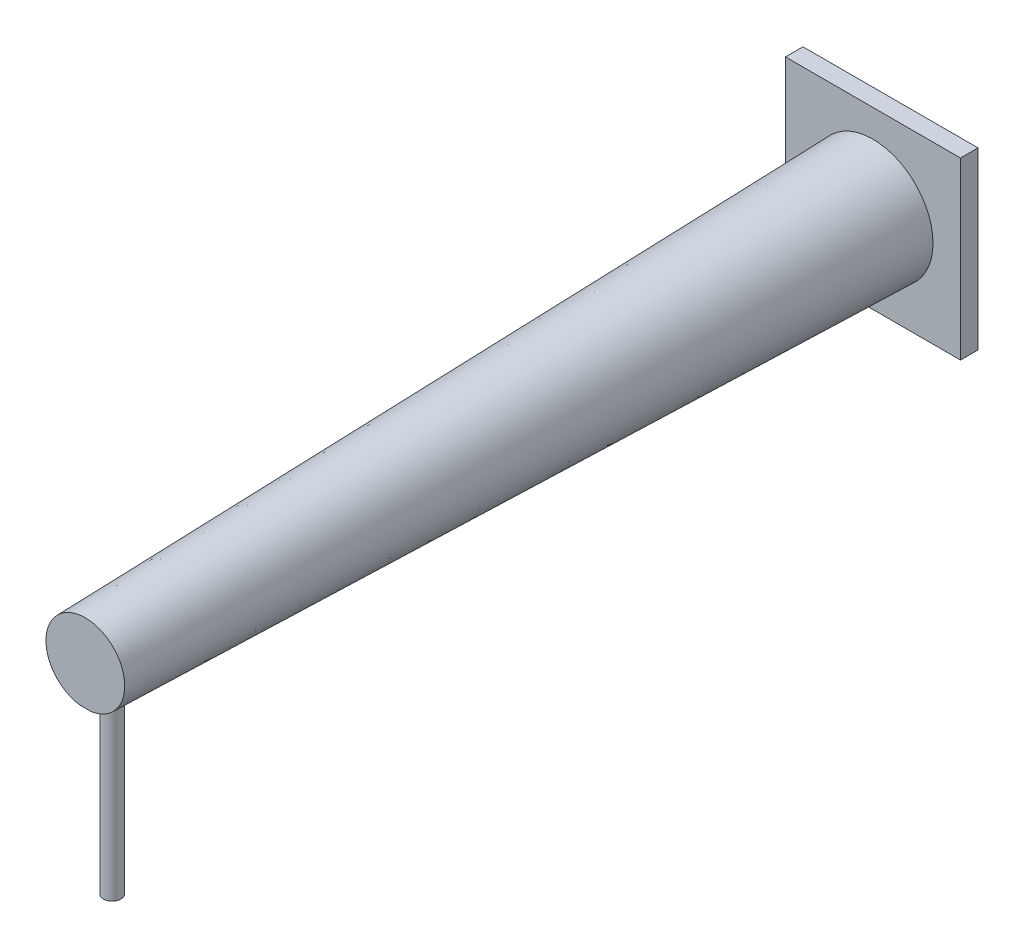
ISO-10303-21;
HEADER;
FILE_DESCRIPTION(('STEP AP214'),'2;1');
FILE_NAME('part.step','',(''),(''),'','','');
FILE_SCHEMA(('AUTOMOTIVE_DESIGN { 1 0 10303 214 1 1 1 1 }'));
ENDSEC;
DATA;
#1=APPLICATION_CONTEXT('core data for automotive mechanical design processes');
#2=APPLICATION_PROTOCOL_DEFINITION('international standard','automotive_design',2000,#1);
#3=PRODUCT_CONTEXT('',#1,'mechanical');
#4=PRODUCT('Part','Part','',(#3));
#5=PRODUCT_RELATED_PRODUCT_CATEGORY('part','',(#4));
#6=PRODUCT_DEFINITION_FORMATION('','',#4);
#7=PRODUCT_DEFINITION_CONTEXT('part definition',#1,'design');
#8=PRODUCT_DEFINITION('design','',#6,#7);
#9=PRODUCT_DEFINITION_SHAPE('','',#8);
#10=(LENGTH_UNIT() NAMED_UNIT(*) SI_UNIT(.MILLI.,.METRE.));
#11=(NAMED_UNIT(*) PLANE_ANGLE_UNIT() SI_UNIT($,.RADIAN.));
#12=(NAMED_UNIT(*) SI_UNIT($,.STERADIAN.) SOLID_ANGLE_UNIT());
#13=UNCERTAINTY_MEASURE_WITH_UNIT(LENGTH_MEASURE(1.E-05),#10,'distance_accuracy_value','');
#14=(GEOMETRIC_REPRESENTATION_CONTEXT(3) GLOBAL_UNCERTAINTY_ASSIGNED_CONTEXT((#13)) GLOBAL_UNIT_ASSIGNED_CONTEXT((#10,
#11,#12)) REPRESENTATION_CONTEXT('',''));
#15=CARTESIAN_POINT('',(0.,0.,0.));
#16=DIRECTION('',(0.,0.,1.));
#17=DIRECTION('',(1.,0.,0.));
#18=AXIS2_PLACEMENT_3D('',#15,#16,#17);
#19=CARTESIAN_POINT('',(50.,50.,10.));
#20=DIRECTION('',(0.,-1.,0.));
#21=DIRECTION('',(0.,0.,-1.));
#22=AXIS2_PLACEMENT_3D('',#19,#20,#21);
#23=PLANE('',#22);
#24=DIRECTION('',(-1.,0.,0.));
#25=VECTOR('',#24,1.);
#26=CARTESIAN_POINT('',(50.,50.,0.));
#27=LINE('',#26,#25);
#28=CARTESIAN_POINT('',(50.,50.,0.));
#29=VERTEX_POINT('',#28);
#30=CARTESIAN_POINT('',(-50.,50.,0.));
#31=VERTEX_POINT('',#30);
#32=EDGE_CURVE('E144',#29,#31,#27,.T.);
#33=ORIENTED_EDGE('',*,*,#32,.T.);
#34=DIRECTION('',(0.,0.,-1.));
#35=VECTOR('',#34,1.);
#36=CARTESIAN_POINT('',(-50.,50.,10.));
#37=LINE('',#36,#35);
#38=CARTESIAN_POINT('',(-50.,50.,10.));
#39=VERTEX_POINT('',#38);
#40=EDGE_CURVE('E146',#39,#31,#37,.T.);
#41=ORIENTED_EDGE('',*,*,#40,.F.);
#42=DIRECTION('',(-1.,0.,0.));
#43=VECTOR('',#42,1.);
#44=CARTESIAN_POINT('',(50.,50.,10.));
#45=LINE('',#44,#43);
#46=CARTESIAN_POINT('',(50.,50.,10.));
#47=VERTEX_POINT('',#46);
#48=EDGE_CURVE('E173',#47,#39,#45,.T.);
#49=ORIENTED_EDGE('',*,*,#48,.F.);
#50=DIRECTION('',(0.,0.,-1.));
#51=VECTOR('',#50,1.);
#52=CARTESIAN_POINT('',(50.,50.,10.));
#53=LINE('',#52,#51);
#54=EDGE_CURVE('E147',#47,#29,#53,.T.);
#55=ORIENTED_EDGE('',*,*,#54,.T.);
#56=EDGE_LOOP('',(#33,#41,#49,#55));
#57=FACE_BOUND('',#56,.T.);
#58=ADVANCED_FACE('F16',(#57),#23,.F.);
#59=CARTESIAN_POINT('',(-50.,50.,10.));
#60=DIRECTION('',(1.,0.,0.));
#61=DIRECTION('',(0.,0.,-1.));
#62=AXIS2_PLACEMENT_3D('',#59,#60,#61);
#63=PLANE('',#62);
#64=DIRECTION('',(0.,-1.,0.));
#65=VECTOR('',#64,1.);
#66=CARTESIAN_POINT('',(-50.,50.,0.));
#67=LINE('',#66,#65);
#68=CARTESIAN_POINT('',(-50.,-50.,0.));
#69=VERTEX_POINT('',#68);
#70=EDGE_CURVE('E149',#31,#69,#67,.T.);
#71=ORIENTED_EDGE('',*,*,#70,.T.);
#72=DIRECTION('',(0.,0.,-1.));
#73=VECTOR('',#72,1.);
#74=CARTESIAN_POINT('',(-50.,-50.,10.));
#75=LINE('',#74,#73);
#76=CARTESIAN_POINT('',(-50.,-50.,10.));
#77=VERTEX_POINT('',#76);
#78=EDGE_CURVE('E163',#77,#69,#75,.T.);
#79=ORIENTED_EDGE('',*,*,#78,.F.);
#80=DIRECTION('',(0.,-1.,0.));
#81=VECTOR('',#80,1.);
#82=CARTESIAN_POINT('',(-50.,50.,10.));
#83=LINE('',#82,#81);
#84=EDGE_CURVE('E70',#39,#77,#83,.T.);
#85=ORIENTED_EDGE('',*,*,#84,.F.);
#86=ORIENTED_EDGE('',*,*,#40,.T.);
#87=EDGE_LOOP('',(#71,#79,#85,#86));
#88=FACE_BOUND('',#87,.T.);
#89=ADVANCED_FACE('F133',(#88),#63,.F.);
#90=CARTESIAN_POINT('',(-50.,-50.,10.));
#91=DIRECTION('',(0.,1.,0.));
#92=DIRECTION('',(0.,0.,1.));
#93=AXIS2_PLACEMENT_3D('',#90,#91,#92);
#94=PLANE('',#93);
#95=DIRECTION('',(1.,0.,0.));
#96=VECTOR('',#95,1.);
#97=CARTESIAN_POINT('',(-50.,-50.,0.));
#98=LINE('',#97,#96);
#99=CARTESIAN_POINT('',(50.,-50.,0.));
#100=VERTEX_POINT('',#99);
#101=EDGE_CURVE('E154',#69,#100,#98,.T.);
#102=ORIENTED_EDGE('',*,*,#101,.T.);
#103=DIRECTION('',(0.,0.,-1.));
#104=VECTOR('',#103,1.);
#105=CARTESIAN_POINT('',(50.,-50.,10.));
#106=LINE('',#105,#104);
#107=CARTESIAN_POINT('',(50.,-50.,10.));
#108=VERTEX_POINT('',#107);
#109=EDGE_CURVE('E161',#108,#100,#106,.T.);
#110=ORIENTED_EDGE('',*,*,#109,.F.);
#111=DIRECTION('',(1.,0.,0.));
#112=VECTOR('',#111,1.);
#113=CARTESIAN_POINT('',(-50.,-50.,10.));
#114=LINE('',#113,#112);
#115=EDGE_CURVE('E169',#77,#108,#114,.T.);
#116=ORIENTED_EDGE('',*,*,#115,.F.);
#117=ORIENTED_EDGE('',*,*,#78,.T.);
#118=EDGE_LOOP('',(#102,#110,#116,#117));
#119=FACE_BOUND('',#118,.T.);
#120=ADVANCED_FACE('F130',(#119),#94,.F.);
#121=CARTESIAN_POINT('',(50.,-50.,10.));
#122=DIRECTION('',(-1.,0.,0.));
#123=DIRECTION('',(0.,0.,1.));
#124=AXIS2_PLACEMENT_3D('',#121,#122,#123);
#125=PLANE('',#124);
#126=DIRECTION('',(0.,1.,0.));
#127=VECTOR('',#126,1.);
#128=CARTESIAN_POINT('',(50.,-50.,0.));
#129=LINE('',#128,#127);
#130=EDGE_CURVE('E62',#100,#29,#129,.T.);
#131=ORIENTED_EDGE('',*,*,#130,.T.);
#132=ORIENTED_EDGE('',*,*,#54,.F.);
#133=DIRECTION('',(0.,1.,0.));
#134=VECTOR('',#133,1.);
#135=CARTESIAN_POINT('',(50.,-50.,10.));
#136=LINE('',#135,#134);
#137=EDGE_CURVE('E41',#108,#47,#136,.T.);
#138=ORIENTED_EDGE('',*,*,#137,.F.);
#139=ORIENTED_EDGE('',*,*,#109,.T.);
#140=EDGE_LOOP('',(#131,#132,#138,#139));
#141=FACE_BOUND('',#140,.T.);
#142=ADVANCED_FACE('F123',(#141),#125,.F.);
#143=CARTESIAN_POINT('',(0.,0.,10.));
#144=DIRECTION('',(0.,0.,1.));
#145=DIRECTION('',(1.,0.,0.));
#146=AXIS2_PLACEMENT_3D('',#143,#144,#145);
#147=PLANE('',#146);
#148=CARTESIAN_POINT('',(0.,0.,10.));
#149=DIRECTION('',(0.,0.,1.));
#150=DIRECTION('',(1.,0.,0.));
#151=AXIS2_PLACEMENT_3D('',#148,#149,#150);
#152=CIRCLE('',#151,34.2836647061341);
#153=CARTESIAN_POINT('',(34.2836647061341,0.,10.));
#154=VERTEX_POINT('',#153);
#155=EDGE_CURVE('E93',#154,#154,#152,.F.);
#156=ORIENTED_EDGE('',*,*,#155,.T.);
#157=EDGE_LOOP('',(#156));
#158=FACE_BOUND('',#157,.T.);
#159=ORIENTED_EDGE('',*,*,#48,.T.);
#160=ORIENTED_EDGE('',*,*,#84,.T.);
#161=ORIENTED_EDGE('',*,*,#115,.T.);
#162=ORIENTED_EDGE('',*,*,#137,.T.);
#163=EDGE_LOOP('',(#159,#160,#161,#162));
#164=FACE_BOUND('',#163,.T.);
#165=ADVANCED_FACE('F119',(#158,#164),#147,.T.);
#166=CARTESIAN_POINT('',(0.,0.,0.));
#167=DIRECTION('',(0.,0.,1.));
#168=DIRECTION('',(1.,0.,0.));
#169=AXIS2_PLACEMENT_3D('',#166,#167,#168);
#170=PLANE('',#169);
#171=ORIENTED_EDGE('',*,*,#32,.F.);
#172=ORIENTED_EDGE('',*,*,#130,.F.);
#173=ORIENTED_EDGE('',*,*,#101,.F.);
#174=ORIENTED_EDGE('',*,*,#70,.F.);
#175=EDGE_LOOP('',(#171,#172,#173,#174));
#176=FACE_BOUND('',#175,.T.);
#177=ADVANCED_FACE('F122',(#176),#170,.F.);
#178=CARTESIAN_POINT('',(0.,0.,460.));
#179=DIRECTION('',(0.,0.,-1.));
#180=DIRECTION('',(1.,0.,0.));
#181=AXIS2_PLACEMENT_3D('',#178,#179,#180);
#182=CONICAL_SURFACE('',#181,22.5,0.0261799387799149);
#183=CARTESIAN_POINT('',(8.94782583044672,-22.2590713590176,403.09143950879));
#184=CARTESIAN_POINT('',(8.81121618471671,-22.2590713590176,405.03666251518));
#185=CARTESIAN_POINT('',(8.67200421125268,-22.2590713590176,406.981706112306));
#186=CARTESIAN_POINT('',(8.3873810814656,-22.2590713590176,410.871361364087));
#187=CARTESIAN_POINT('',(8.24196985474241,-22.2590713590176,412.815973013584));
#188=CARTESIAN_POINT('',(7.94389281541121,-22.2590713590176,416.70548130393));
#189=CARTESIAN_POINT('',(7.79122391685583,-22.2590713590176,418.650377709056));
#190=CARTESIAN_POINT('',(7.47731813674799,-22.2590713590176,422.539470138632));
#191=CARTESIAN_POINT('',(7.31608130406305,-22.2590713590176,424.483666167013));
#192=CARTESIAN_POINT('',(6.98351976372915,-22.2590713590176,428.36752289011));
#193=CARTESIAN_POINT('',(6.81221455777218,-22.2590713590176,430.307185248331));
#194=CARTESIAN_POINT('',(6.45669313566351,-22.2590713590176,434.185362974339));
#195=CARTESIAN_POINT('',(6.27247673328572,-22.2590713590176,436.123878325175));
#196=CARTESIAN_POINT('',(5.88737803848389,-22.2590713590176,439.998865345679));
#197=CARTESIAN_POINT('',(5.6864991171596,-22.2590713590176,441.935337348852));
#198=CARTESIAN_POINT('',(5.26220273261782,-22.2590713590176,445.805794352254));
#199=CARTESIAN_POINT('',(5.03878603283048,-22.2590713590176,447.739779434477));
#200=CARTESIAN_POINT('',(4.67860806484179,-22.2590713590176,450.637914861297));
#201=CARTESIAN_POINT('',(4.55435474537474,-22.2590713590176,451.603616793785));
#202=CARTESIAN_POINT('',(4.29515400802364,-22.2590713590176,453.533704259943));
#203=CARTESIAN_POINT('',(4.16020543843311,-22.2590713590176,454.498089640436));
#204=CARTESIAN_POINT('',(3.87593318034713,-22.2590713590176,456.426601369568));
#205=CARTESIAN_POINT('',(3.72658296337799,-22.2590713590176,457.390723828244));
#206=CARTESIAN_POINT('',(3.40818025525486,-22.2590713590176,459.315547652907));
#207=CARTESIAN_POINT('',(3.23913274407564,-22.2590713590176,460.276249820601));
#208=CARTESIAN_POINT('',(2.9621726983441,-22.2590713590176,461.713839136713));
#209=CARTESIAN_POINT('',(2.86584475289562,-22.2590713590176,462.192943260855));
#210=CARTESIAN_POINT('',(2.66268146805182,-22.2590713590176,463.149170511164));
#211=CARTESIAN_POINT('',(2.55584112556703,-22.2590713590176,463.626292580345));
#212=CARTESIAN_POINT('',(2.32783540115785,-22.2590713590176,464.576081424215));
#213=CARTESIAN_POINT('',(2.20670257318011,-22.2590713590176,465.048755773751));
#214=CARTESIAN_POINT('',(2.00793729753543,-22.2590713590176,465.75277651935));
#215=CARTESIAN_POINT('',(1.93886675533128,-22.2590713590176,465.986532200585));
#216=CARTESIAN_POINT('',(1.79310405025626,-22.2590713590176,466.451638464097));
#217=CARTESIAN_POINT('',(1.71641387889937,-22.2590713590176,466.682989657456));
#218=CARTESIAN_POINT('',(1.55213641099174,-22.2590713590176,467.142341298732));
#219=CARTESIAN_POINT('',(1.46452625916098,-22.2590713590176,467.370333563087));
#220=CARTESIAN_POINT('',(1.27291716678972,-22.2590713590176,467.820015694664));
#221=CARTESIAN_POINT('',(1.16890708740837,-22.2590713590176,468.041701156616));
#222=CARTESIAN_POINT('',(0.990409295185039,-22.2590713590176,468.36260804873));
#223=CARTESIAN_POINT('',(0.926960788274689,-22.2590713590176,468.467908760729));
#224=CARTESIAN_POINT('',(0.789069686460505,-22.2590713590176,468.670912684124));
#225=CARTESIAN_POINT('',(0.714676288971341,-22.2590713590176,468.768647051901));
#226=CARTESIAN_POINT('',(0.598158516211132,-22.2590713590176,468.89475761117));
#227=CARTESIAN_POINT('',(0.563257207019384,-22.2590713590176,468.929729652029));
#228=CARTESIAN_POINT('',(0.489928309385427,-22.2590713590176,468.995978424692));
#229=CARTESIAN_POINT('',(0.4514946264394,-22.2590713590176,469.027248548502));
#230=CARTESIAN_POINT('',(0.3700280596421,-22.2590713590176,469.084693012569));
#231=CARTESIAN_POINT('',(0.326935321158122,-22.2590713590176,469.110784728925));
#232=CARTESIAN_POINT('',(0.236626686244019,-22.2590713590176,469.154385634915));
#233=CARTESIAN_POINT('',(0.189430415766248,-22.2590713590176,469.17193328582));
#234=CARTESIAN_POINT('',(0.108101917319947,-22.2590713590176,469.191591362562));
#235=CARTESIAN_POINT('',(0.0747385691324554,-22.2590713590176,469.196872108404));
#236=CARTESIAN_POINT('',(0.00759661510970232,-22.2590713590176,469.201607485848));
#237=CARTESIAN_POINT('',(-0.0261817943991428,-22.2590713590176,469.201064773471));
#238=CARTESIAN_POINT('',(-0.0930593842302582,-22.2590713590176,469.194224010531));
#239=CARTESIAN_POINT('',(-0.126159855549311,-22.2590713590176,469.187938194291));
#240=CARTESIAN_POINT('',(-0.190980516464606,-22.2590713590176,469.170310744999));
#241=CARTESIAN_POINT('',(-0.222699209217021,-22.2590713590176,469.158963771826));
#242=CARTESIAN_POINT('',(-0.300875263075973,-22.2590713590176,469.124968992045));
#243=CARTESIAN_POINT('',(-0.346104911794393,-22.2590713590176,469.099524556124));
#244=CARTESIAN_POINT('',(-0.43217550799283,-22.2590713590176,469.04208360073));
#245=CARTESIAN_POINT('',(-0.473002726991357,-22.2590713590176,469.010067440823));
#246=CARTESIAN_POINT('',(-0.588784729304202,-22.2590713590176,468.908481329042));
#247=CARTESIAN_POINT('',(-0.658218641980731,-22.2590713590176,468.83272297156));
#248=CARTESIAN_POINT('',(-0.786932519866958,-22.2590713590176,468.673139905195));
#249=CARTESIAN_POINT('',(-0.846176467847854,-22.2590713590176,468.589288155861));
#250=CARTESIAN_POINT('',(-1.00807090560526,-22.2590713590176,468.339205156592));
#251=CARTESIAN_POINT('',(-1.10150069175788,-22.2590713590176,468.167076861925));
#252=CARTESIAN_POINT('',(-1.27401554081695,-22.2590713590176,467.81566388809));
#253=CARTESIAN_POINT('',(-1.3530591200727,-22.2590713590176,467.636360276817));
#254=CARTESIAN_POINT('',(-1.50181632643741,-22.2590713590176,467.272871166269));
#255=CARTESIAN_POINT('',(-1.57148090735755,-22.2590713590176,467.088665612203));
#256=CARTESIAN_POINT('',(-1.70371093555383,-22.2590713590176,466.718074931686));
#257=CARTESIAN_POINT('',(-1.76628646648292,-22.2590713590176,466.531693327893));
#258=CARTESIAN_POINT('',(-1.94468910366621,-22.2590713590176,465.974779945416));
#259=CARTESIAN_POINT('',(-2.05296684053871,-22.2590713590176,465.601838501305));
#260=CARTESIAN_POINT('',(-2.25656346375693,-22.2590713590176,464.852404399812));
#261=CARTESIAN_POINT('',(-2.35187780975347,-22.2590713590176,464.47591054734));
#262=CARTESIAN_POINT('',(-2.53331116360501,-22.2590713590176,463.720164552686));
#263=CARTESIAN_POINT('',(-2.61941705662314,-22.2590713590176,463.340909277015));
#264=CARTESIAN_POINT('',(-2.78456254045869,-22.2590713590176,462.580856001317));
#265=CARTESIAN_POINT('',(-2.8636017058478,-22.2590713590176,462.200057909849));
#266=CARTESIAN_POINT('',(-3.09200290593504,-22.2590713590176,461.058205362829));
#267=CARTESIAN_POINT('',(-3.23315093993279,-22.2590713590176,460.29551115483));
#268=CARTESIAN_POINT('',(-3.50050736978978,-22.2590713590176,458.768199539222));
#269=CARTESIAN_POINT('',(-3.62672773117435,-22.2590713590176,458.003584180587));
#270=CARTESIAN_POINT('',(-3.86777032481604,-22.2590713590176,456.475370025768));
#271=CARTESIAN_POINT('',(-3.9826317152826,-22.2590713590176,455.711777377425));
#272=CARTESIAN_POINT('',(-4.20390777818988,-22.2590713590176,454.183367864205));
#273=CARTESIAN_POINT('',(-4.31032232782621,-22.2590713590176,453.418550981695));
#274=CARTESIAN_POINT('',(-4.61949506275678,-22.2590713590176,451.12263421235));
#275=CARTESIAN_POINT('',(-4.81216564713552,-22.2590713590176,449.590177557665));
#276=CARTESIAN_POINT('',(-5.17897836401676,-22.2590713590176,446.522213052453));
#277=CARTESIAN_POINT('',(-5.35310999709638,-22.2590713590176,444.986703969361));
#278=CARTESIAN_POINT('',(-5.68735410291748,-22.2590713590176,441.914230308013));
#279=CARTESIAN_POINT('',(-5.847467141288,-22.2590713590176,440.377265791013));
#280=CARTESIAN_POINT('',(-6.15683086608441,-22.2590713590176,437.301416293465));
#281=CARTESIAN_POINT('',(-6.30607566710444,-22.2590713590176,435.762530724691));
#282=CARTESIAN_POINT('',(-6.59568288479815,-22.2590713590176,432.683912395308));
#283=CARTESIAN_POINT('',(-6.73604521238447,-22.2590713590176,431.144179626358));
#284=CARTESIAN_POINT('',(-7.14611092740928,-22.2590713590176,426.524702605109));
#285=CARTESIAN_POINT('',(-7.40486138599155,-22.2590713590176,423.443984707803));
#286=CARTESIAN_POINT('',(-7.76891300824028,-22.2590713590176,418.923239775212));
#287=CARTESIAN_POINT('',(-7.8824986904461,-22.2590713590176,417.48386613195));
#288=CARTESIAN_POINT('',(-8.10556151558632,-22.2590713590176,414.604727797798));
#289=CARTESIAN_POINT('',(-8.21503845597222,-22.2590713590176,413.164963091145));
#290=CARTESIAN_POINT('',(-8.43027177090084,-22.2590713590176,410.286336000937));
#291=CARTESIAN_POINT('',(-8.53603110373115,-22.2590713590176,408.847473837803));
#292=CARTESIAN_POINT('',(-8.74428428384658,-22.2590713590176,405.969587917617));
#293=CARTESIAN_POINT('',(-8.84677829981365,-22.2590713590176,404.530564172778));
#294=CARTESIAN_POINT('',(-8.94782583044672,-22.2590713590176,403.09143950879));
#295=B_SPLINE_CURVE_WITH_KNOTS('',3,(#183,#184,#185,#186,#187,#188,#189,#190,#191,#192,#193,
#194,#195,#196,#197,#198,#199,#200,#201,#202,#203,#204,#205,#206,#207,#208,#209,#210,#211,#212,
#213,#214,#215,#216,#217,#218,#219,#220,#221,#222,#223,#224,#225,#226,#227,#228,#229,#230,#231,
#232,#233,#234,#235,#236,#237,#238,#239,#240,#241,#242,#243,#244,#245,#246,#247,#248,#249,#250,
#251,#252,#253,#254,#255,#256,#257,#258,#259,#260,#261,#262,#263,#264,#265,#266,#267,#268,#269,
#270,#271,#272,#273,#274,#275,#276,#277,#278,#279,#280,#281,#282,#283,#284,#285,#286,#287,#288,
#289,#290,#291,#292,#293,#294),.UNSPECIFIED.,.F.,.F.,(4,2,2,2,2,2,2,2,2,2,2,2,2,2,2,2,2,2,2,2,2,
2,2,2,2,2,2,2,2,2,2,2,2,2,2,2,2,2,2,2,2,2,2,2,2,2,2,2,2,2,2,2,2,2,2,4),(0.,5.85004533682634,
11.7001571258059,17.5527790161495,23.4053675294277,29.2469714496864,35.08865964433,
40.9291688393008,46.7694802630257,49.6904266265838,52.61168795759,55.5384370916523,
58.4644478684601,59.9304352164757,61.397123667416,62.8605336939501,63.5916944582005,
64.3226646219099,65.0551912222949,65.7882175155265,66.1567274048152,66.5236287700761,
66.6716640153369,66.8199596444204,66.9704588357802,67.1202741405957,67.2211489316114,
67.3219777165958,67.4225922092799,67.5233131142388,67.6780986738326,67.8333537471246,
68.139927445716,68.4475634268329,69.0335200509891,69.6211404401719,70.2117233295222,
70.8014553208961,71.9660369784141,73.1310254789552,74.2976516788793,75.4643480643441,
77.7910281032457,80.1158303279204,82.4323162738209,84.7488358917831,89.3822069335686,
94.0181882523957,98.6539824301182,103.29226861358,107.930601309678,117.20517194889,
121.536715016977,125.868471337266,130.19669881245,134.52470233336),.UNSPECIFIED.);
#296=CARTESIAN_POINT('',(5.95948704889321,-22.2590713590176,439.262096628897));
#297=VERTEX_POINT('',#296);
#298=CARTESIAN_POINT('',(3.28386087314314,-22.2590713590176,460.));
#299=VERTEX_POINT('',#298);
#300=EDGE_CURVE('E32',#297,#299,#295,.T.);
#301=ORIENTED_EDGE('',*,*,#300,.F.);
#302=CARTESIAN_POINT('',(0.,0.,439.262096628897));
#303=DIRECTION('',(0.,0.,-1.));
#304=DIRECTION('',(-1.,0.,0.));
#305=AXIS2_PLACEMENT_3D('',#302,#303,#304);
#306=CIRCLE('',#305,23.0430411111851);
#307=CARTESIAN_POINT('',(-5.95948704889322,-22.2590713590176,439.262096628897));
#308=VERTEX_POINT('',#307);
#309=EDGE_CURVE('E10',#308,#297,#306,.F.);
#310=ORIENTED_EDGE('',*,*,#309,.F.);
#311=CARTESIAN_POINT('',(-3.28386087314314,-22.2590713590176,460.));
#312=VERTEX_POINT('',#311);
#313=EDGE_CURVE('E85',#312,#308,#295,.T.);
#314=ORIENTED_EDGE('',*,*,#313,.F.);
#315=CARTESIAN_POINT('',(0.,0.,460.));
#316=DIRECTION('',(0.,0.,-1.));
#317=DIRECTION('',(-1.,0.,0.));
#318=AXIS2_PLACEMENT_3D('',#315,#316,#317);
#319=CIRCLE('',#318,22.5);
#320=EDGE_CURVE('E92',#312,#299,#319,.T.);
#321=ORIENTED_EDGE('',*,*,#320,.T.);
#322=EDGE_LOOP('',(#301,#310,#314,#321));
#323=FACE_BOUND('',#322,.T.);
#324=ORIENTED_EDGE('',*,*,#155,.F.);
#325=EDGE_LOOP('',(#324));
#326=FACE_BOUND('',#325,.T.);
#327=ADVANCED_FACE('F18',(#323,#326),#182,.T.);
#328=CARTESIAN_POINT('',(0.,0.,460.));
#329=DIRECTION('',(0.,0.,-1.));
#330=DIRECTION('',(-1.,0.,0.));
#331=AXIS2_PLACEMENT_3D('',#328,#329,#330);
#332=PLANE('',#331);
#333=ORIENTED_EDGE('',*,*,#320,.F.);
#334=DIRECTION('',(1.,0.,0.));
#335=VECTOR('',#334,1.);
#336=CARTESIAN_POINT('',(0.,-22.2590713590176,460.));
#337=LINE('',#336,#335);
#338=EDGE_CURVE('E25',#312,#299,#337,.T.);
#339=ORIENTED_EDGE('',*,*,#338,.T.);
#340=EDGE_LOOP('',(#333,#339));
#341=FACE_BOUND('',#340,.T.);
#342=ADVANCED_FACE('F115',(#341),#332,.F.);
#343=CARTESIAN_POINT('',(23.0430411111851,-27.9442550281649,439.262096628897));
#344=DIRECTION('',(0.,0.,-1.));
#345=DIRECTION('',(-1.,0.,0.));
#346=AXIS2_PLACEMENT_3D('',#343,#344,#345);
#347=PLANE('',#346);
#348=ORIENTED_EDGE('',*,*,#309,.T.);
#349=DIRECTION('',(-1.,0.,0.));
#350=VECTOR('',#349,1.);
#351=CARTESIAN_POINT('',(23.0430411111851,-22.2590713590176,439.262096628897));
#352=LINE('',#351,#350);
#353=EDGE_CURVE('E81',#297,#308,#352,.T.);
#354=ORIENTED_EDGE('',*,*,#353,.T.);
#355=EDGE_LOOP('',(#348,#354));
#356=FACE_BOUND('',#355,.T.);
#357=ADVANCED_FACE('F80',(#356),#347,.F.);
#358=CARTESIAN_POINT('',(0.,-22.2590713590176,0.));
#359=DIRECTION('',(0.,1.,0.));
#360=DIRECTION('',(0.,0.,1.));
#361=AXIS2_PLACEMENT_3D('',#358,#359,#360);
#362=PLANE('',#361);
#363=CARTESIAN_POINT('',(-0.389465529322163,-22.2590713590176,444.275062975229));
#364=DIRECTION('',(0.,1.,0.));
#365=DIRECTION('',(1.,0.,0.));
#366=AXIS2_PLACEMENT_3D('',#363,#364,#365);
#367=CIRCLE('',#366,5.);
#368=CARTESIAN_POINT('',(4.61053447067784,-22.2590713590176,444.275062975229));
#369=VERTEX_POINT('',#368);
#370=EDGE_CURVE('E183',#369,#369,#367,.T.);
#371=ORIENTED_EDGE('',*,*,#370,.T.);
#372=EDGE_LOOP('',(#371));
#373=FACE_BOUND('',#372,.T.);
#374=ORIENTED_EDGE('',*,*,#300,.T.);
#375=ORIENTED_EDGE('',*,*,#338,.F.);
#376=ORIENTED_EDGE('',*,*,#313,.T.);
#377=ORIENTED_EDGE('',*,*,#353,.F.);
#378=EDGE_LOOP('',(#374,#375,#376,#377));
#379=FACE_BOUND('',#378,.T.);
#380=ADVANCED_FACE('F84',(#373,#379),#362,.F.);
#381=CARTESIAN_POINT('',(-0.389465529322163,-122.259071359018,444.275062975229));
#382=DIRECTION('',(0.,1.,0.));
#383=DIRECTION('',(0.,0.,1.));
#384=AXIS2_PLACEMENT_3D('',#381,#382,#383);
#385=CYLINDRICAL_SURFACE('',#384,5.);
#386=CARTESIAN_POINT('',(-0.389465529322163,-122.259071359018,444.275062975229));
#387=DIRECTION('',(0.,1.,0.));
#388=DIRECTION('',(1.,0.,0.));
#389=AXIS2_PLACEMENT_3D('',#386,#387,#388);
#390=CIRCLE('',#389,5.);
#391=CARTESIAN_POINT('',(4.61053447067784,-122.259071359018,444.275062975229));
#392=VERTEX_POINT('',#391);
#393=EDGE_CURVE('E87',#392,#392,#390,.T.);
#394=ORIENTED_EDGE('',*,*,#393,.T.);
#395=EDGE_LOOP('',(#394));
#396=FACE_BOUND('',#395,.T.);
#397=ORIENTED_EDGE('',*,*,#370,.F.);
#398=EDGE_LOOP('',(#397));
#399=FACE_BOUND('',#398,.T.);
#400=ADVANCED_FACE('F110',(#396,#399),#385,.T.);
#401=CARTESIAN_POINT('',(-0.389465529322163,-122.259071359018,444.275062975229));
#402=DIRECTION('',(0.,1.,0.));
#403=DIRECTION('',(0.,0.,1.));
#404=AXIS2_PLACEMENT_3D('',#401,#402,#403);
#405=PLANE('',#404);
#406=ORIENTED_EDGE('',*,*,#393,.F.);
#407=EDGE_LOOP('',(#406));
#408=FACE_BOUND('',#407,.T.);
#409=ADVANCED_FACE('F193',(#408),#405,.F.);
#410=CLOSED_SHELL('',(#58,#89,#120,#142,#165,#177,#327,#342,#357,#380,#400,#409));
#411=MANIFOLD_SOLID_BREP('B1',#410);
#412=ADVANCED_BREP_SHAPE_REPRESENTATION('',(#18,#411),#14);
#413=SHAPE_DEFINITION_REPRESENTATION(#9,#412);
ENDSEC;
END-ISO-10303-21;
